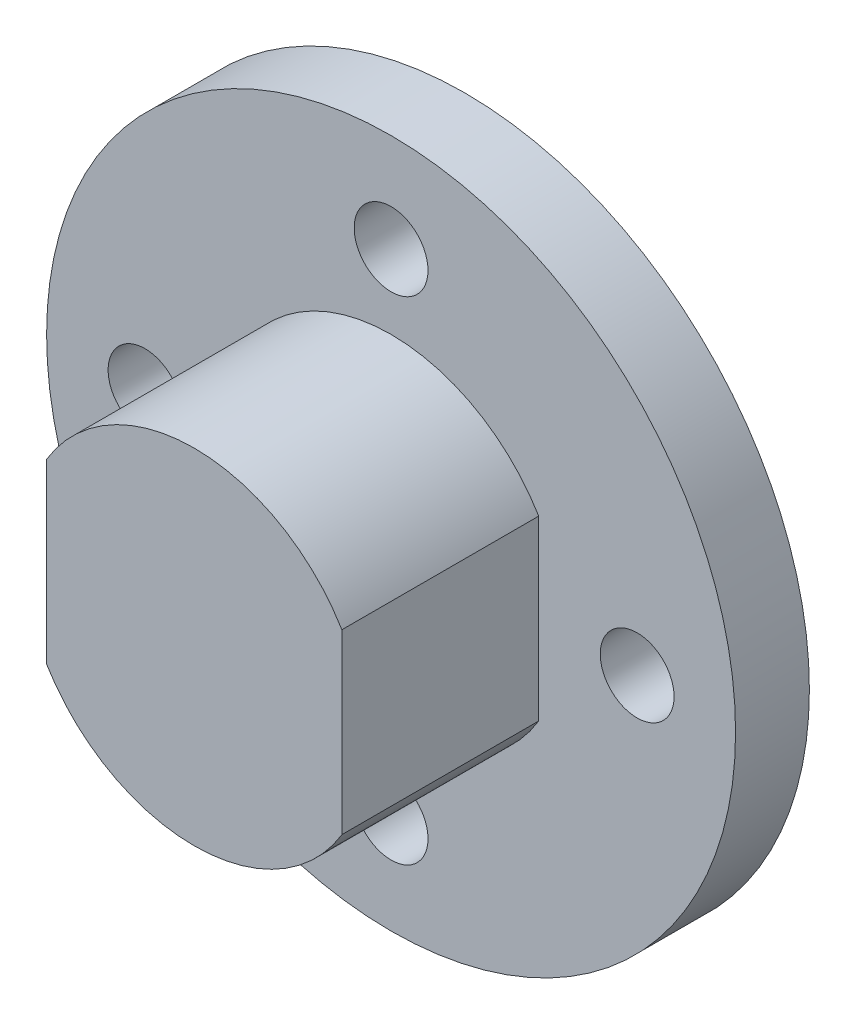
ISO-10303-21;
HEADER;
FILE_DESCRIPTION(('STEP AP214'),'2;1');
FILE_NAME('part.step','',(''),(''),'','','');
FILE_SCHEMA(('AUTOMOTIVE_DESIGN { 1 0 10303 214 1 1 1 1 }'));
ENDSEC;
DATA;
#1=APPLICATION_CONTEXT('core data for automotive mechanical design processes');
#2=APPLICATION_PROTOCOL_DEFINITION('international standard','automotive_design',2000,#1);
#3=PRODUCT_CONTEXT('',#1,'mechanical');
#4=PRODUCT('Part','Part','',(#3));
#5=PRODUCT_RELATED_PRODUCT_CATEGORY('part','',(#4));
#6=PRODUCT_DEFINITION_FORMATION('','',#4);
#7=PRODUCT_DEFINITION_CONTEXT('part definition',#1,'design');
#8=PRODUCT_DEFINITION('design','',#6,#7);
#9=PRODUCT_DEFINITION_SHAPE('','',#8);
#10=(LENGTH_UNIT() NAMED_UNIT(*) SI_UNIT(.MILLI.,.METRE.));
#11=(NAMED_UNIT(*) PLANE_ANGLE_UNIT() SI_UNIT($,.RADIAN.));
#12=(NAMED_UNIT(*) SI_UNIT($,.STERADIAN.) SOLID_ANGLE_UNIT());
#13=UNCERTAINTY_MEASURE_WITH_UNIT(LENGTH_MEASURE(1.E-05),#10,'distance_accuracy_value','');
#14=(GEOMETRIC_REPRESENTATION_CONTEXT(3) GLOBAL_UNCERTAINTY_ASSIGNED_CONTEXT((#13)) GLOBAL_UNIT_ASSIGNED_CONTEXT((#10,
#11,#12)) REPRESENTATION_CONTEXT('',''));
#15=CARTESIAN_POINT('',(0.,0.,0.));
#16=DIRECTION('',(0.,0.,1.));
#17=DIRECTION('',(1.,0.,0.));
#18=AXIS2_PLACEMENT_3D('',#15,#16,#17);
#19=CARTESIAN_POINT('',(0.,0.,3.));
#20=DIRECTION('',(0.,0.,1.));
#21=DIRECTION('',(1.,0.,0.));
#22=AXIS2_PLACEMENT_3D('',#19,#20,#21);
#23=PLANE('',#22);
#24=CARTESIAN_POINT('',(0.,-10.,3.));
#25=DIRECTION('',(0.,0.,1.));
#26=DIRECTION('',(1.,0.,0.));
#27=AXIS2_PLACEMENT_3D('',#24,#25,#26);
#28=CIRCLE('',#27,1.5);
#29=CARTESIAN_POINT('',(1.5,-10.,3.));
#30=VERTEX_POINT('',#29);
#31=EDGE_CURVE('E143',#30,#30,#28,.T.);
#32=ORIENTED_EDGE('',*,*,#31,.F.);
#33=EDGE_LOOP('',(#32));
#34=FACE_BOUND('',#33,.T.);
#35=CARTESIAN_POINT('',(0.,10.,3.));
#36=DIRECTION('',(0.,0.,1.));
#37=DIRECTION('',(1.,0.,0.));
#38=AXIS2_PLACEMENT_3D('',#35,#36,#37);
#39=CIRCLE('',#38,1.5);
#40=CARTESIAN_POINT('',(1.5,10.,3.));
#41=VERTEX_POINT('',#40);
#42=EDGE_CURVE('E159',#41,#41,#39,.T.);
#43=ORIENTED_EDGE('',*,*,#42,.F.);
#44=EDGE_LOOP('',(#43));
#45=FACE_BOUND('',#44,.T.);
#46=CARTESIAN_POINT('',(0.,0.,3.));
#47=DIRECTION('',(0.,0.,1.));
#48=DIRECTION('',(1.,0.,0.));
#49=AXIS2_PLACEMENT_3D('',#46,#47,#48);
#50=CIRCLE('',#49,14.);
#51=CARTESIAN_POINT('',(14.,0.,3.));
#52=VERTEX_POINT('',#51);
#53=EDGE_CURVE('E11',#52,#52,#50,.T.);
#54=ORIENTED_EDGE('',*,*,#53,.T.);
#55=EDGE_LOOP('',(#54));
#56=FACE_BOUND('',#55,.T.);
#57=CARTESIAN_POINT('',(10.,0.,3.));
#58=DIRECTION('',(0.,0.,1.));
#59=DIRECTION('',(1.,0.,0.));
#60=AXIS2_PLACEMENT_3D('',#57,#58,#59);
#61=CIRCLE('',#60,1.5);
#62=CARTESIAN_POINT('',(11.5,0.,3.));
#63=VERTEX_POINT('',#62);
#64=EDGE_CURVE('E151',#63,#63,#61,.T.);
#65=ORIENTED_EDGE('',*,*,#64,.F.);
#66=EDGE_LOOP('',(#65));
#67=FACE_BOUND('',#66,.T.);
#68=CARTESIAN_POINT('',(-10.,0.,3.));
#69=DIRECTION('',(0.,0.,1.));
#70=DIRECTION('',(1.,0.,0.));
#71=AXIS2_PLACEMENT_3D('',#68,#69,#70);
#72=CIRCLE('',#71,1.5);
#73=CARTESIAN_POINT('',(-8.5,0.,3.));
#74=VERTEX_POINT('',#73);
#75=EDGE_CURVE('E135',#74,#74,#72,.T.);
#76=ORIENTED_EDGE('',*,*,#75,.F.);
#77=EDGE_LOOP('',(#76));
#78=FACE_BOUND('',#77,.T.);
#79=DIRECTION('',(0.,-1.,0.));
#80=VECTOR('',#79,1.);
#81=CARTESIAN_POINT('',(-6.,3.60555127546399,3.));
#82=LINE('',#81,#80);
#83=CARTESIAN_POINT('',(-6.,3.60555127546399,3.));
#84=VERTEX_POINT('',#83);
#85=CARTESIAN_POINT('',(-6.,-3.60555127546399,3.));
#86=VERTEX_POINT('',#85);
#87=EDGE_CURVE('E103',#84,#86,#82,.T.);
#88=ORIENTED_EDGE('',*,*,#87,.F.);
#89=CARTESIAN_POINT('',(0.,0.,3.));
#90=DIRECTION('',(0.,0.,1.));
#91=DIRECTION('',(-1.,0.,0.));
#92=AXIS2_PLACEMENT_3D('',#89,#90,#91);
#93=CIRCLE('',#92,7.);
#94=CARTESIAN_POINT('',(6.,3.60555127546399,3.));
#95=VERTEX_POINT('',#94);
#96=EDGE_CURVE('E117',#95,#84,#93,.T.);
#97=ORIENTED_EDGE('',*,*,#96,.F.);
#98=DIRECTION('',(0.,1.,0.));
#99=VECTOR('',#98,1.);
#100=CARTESIAN_POINT('',(6.,3.60555127546399,3.));
#101=LINE('',#100,#99);
#102=CARTESIAN_POINT('',(6.,-3.60555127546399,3.));
#103=VERTEX_POINT('',#102);
#104=EDGE_CURVE('E83',#103,#95,#101,.T.);
#105=ORIENTED_EDGE('',*,*,#104,.F.);
#106=CARTESIAN_POINT('',(0.,0.,3.));
#107=DIRECTION('',(0.,0.,1.));
#108=DIRECTION('',(1.,0.,0.));
#109=AXIS2_PLACEMENT_3D('',#106,#107,#108);
#110=CIRCLE('',#109,7.);
#111=EDGE_CURVE('E123',#86,#103,#110,.T.);
#112=ORIENTED_EDGE('',*,*,#111,.F.);
#113=EDGE_LOOP('',(#88,#97,#105,#112));
#114=FACE_BOUND('',#113,.T.);
#115=ADVANCED_FACE('F45',(#34,#45,#56,#67,#78,#114),#23,.T.);
#116=CARTESIAN_POINT('',(0.,0.,0.));
#117=DIRECTION('',(0.,0.,1.));
#118=DIRECTION('',(1.,0.,0.));
#119=AXIS2_PLACEMENT_3D('',#116,#117,#118);
#120=PLANE('',#119);
#121=CARTESIAN_POINT('',(0.,0.,0.));
#122=DIRECTION('',(0.,0.,1.));
#123=DIRECTION('',(1.,0.,0.));
#124=AXIS2_PLACEMENT_3D('',#121,#122,#123);
#125=CIRCLE('',#124,14.);
#126=CARTESIAN_POINT('',(14.,0.,0.));
#127=VERTEX_POINT('',#126);
#128=EDGE_CURVE('E49',#127,#127,#125,.T.);
#129=ORIENTED_EDGE('',*,*,#128,.F.);
#130=EDGE_LOOP('',(#129));
#131=FACE_BOUND('',#130,.T.);
#132=CARTESIAN_POINT('',(0.,10.,0.));
#133=DIRECTION('',(0.,0.,1.));
#134=DIRECTION('',(1.,0.,0.));
#135=AXIS2_PLACEMENT_3D('',#132,#133,#134);
#136=CIRCLE('',#135,1.5);
#137=CARTESIAN_POINT('',(1.5,10.,0.));
#138=VERTEX_POINT('',#137);
#139=EDGE_CURVE('E155',#138,#138,#136,.T.);
#140=ORIENTED_EDGE('',*,*,#139,.T.);
#141=EDGE_LOOP('',(#140));
#142=FACE_BOUND('',#141,.T.);
#143=CARTESIAN_POINT('',(10.,0.,0.));
#144=DIRECTION('',(0.,0.,1.));
#145=DIRECTION('',(1.,0.,0.));
#146=AXIS2_PLACEMENT_3D('',#143,#144,#145);
#147=CIRCLE('',#146,1.5);
#148=CARTESIAN_POINT('',(11.5,0.,0.));
#149=VERTEX_POINT('',#148);
#150=EDGE_CURVE('E147',#149,#149,#147,.T.);
#151=ORIENTED_EDGE('',*,*,#150,.T.);
#152=EDGE_LOOP('',(#151));
#153=FACE_BOUND('',#152,.T.);
#154=CARTESIAN_POINT('',(0.,-10.,0.));
#155=DIRECTION('',(0.,0.,1.));
#156=DIRECTION('',(1.,0.,0.));
#157=AXIS2_PLACEMENT_3D('',#154,#155,#156);
#158=CIRCLE('',#157,1.5);
#159=CARTESIAN_POINT('',(1.5,-10.,0.));
#160=VERTEX_POINT('',#159);
#161=EDGE_CURVE('E139',#160,#160,#158,.T.);
#162=ORIENTED_EDGE('',*,*,#161,.T.);
#163=EDGE_LOOP('',(#162));
#164=FACE_BOUND('',#163,.T.);
#165=CARTESIAN_POINT('',(-10.,0.,0.));
#166=DIRECTION('',(0.,0.,1.));
#167=DIRECTION('',(1.,0.,0.));
#168=AXIS2_PLACEMENT_3D('',#165,#166,#167);
#169=CIRCLE('',#168,1.5);
#170=CARTESIAN_POINT('',(-8.5,0.,0.));
#171=VERTEX_POINT('',#170);
#172=EDGE_CURVE('E134',#171,#171,#169,.T.);
#173=ORIENTED_EDGE('',*,*,#172,.T.);
#174=EDGE_LOOP('',(#173));
#175=FACE_BOUND('',#174,.T.);
#176=ADVANCED_FACE('F167',(#131,#142,#153,#164,#175),#120,.F.);
#177=CARTESIAN_POINT('',(0.,0.,3.));
#178=DIRECTION('',(0.,0.,-1.));
#179=DIRECTION('',(-1.,0.,0.));
#180=AXIS2_PLACEMENT_3D('',#177,#178,#179);
#181=CYLINDRICAL_SURFACE('',#180,14.);
#182=ORIENTED_EDGE('',*,*,#53,.F.);
#183=EDGE_LOOP('',(#182));
#184=FACE_BOUND('',#183,.T.);
#185=ORIENTED_EDGE('',*,*,#128,.T.);
#186=EDGE_LOOP('',(#185));
#187=FACE_BOUND('',#186,.T.);
#188=ADVANCED_FACE('F47',(#184,#187),#181,.T.);
#189=CARTESIAN_POINT('',(0.,10.,3.));
#190=DIRECTION('',(0.,0.,-1.));
#191=DIRECTION('',(-1.,0.,0.));
#192=AXIS2_PLACEMENT_3D('',#189,#190,#191);
#193=CYLINDRICAL_SURFACE('',#192,1.5);
#194=ORIENTED_EDGE('',*,*,#42,.T.);
#195=EDGE_LOOP('',(#194));
#196=FACE_BOUND('',#195,.T.);
#197=ORIENTED_EDGE('',*,*,#139,.F.);
#198=EDGE_LOOP('',(#197));
#199=FACE_BOUND('',#198,.T.);
#200=ADVANCED_FACE('F170',(#196,#199),#193,.F.);
#201=CARTESIAN_POINT('',(10.,0.,3.));
#202=DIRECTION('',(0.,0.,-1.));
#203=DIRECTION('',(-1.,0.,0.));
#204=AXIS2_PLACEMENT_3D('',#201,#202,#203);
#205=CYLINDRICAL_SURFACE('',#204,1.5);
#206=ORIENTED_EDGE('',*,*,#64,.T.);
#207=EDGE_LOOP('',(#206));
#208=FACE_BOUND('',#207,.T.);
#209=ORIENTED_EDGE('',*,*,#150,.F.);
#210=EDGE_LOOP('',(#209));
#211=FACE_BOUND('',#210,.T.);
#212=ADVANCED_FACE('F172',(#208,#211),#205,.F.);
#213=CARTESIAN_POINT('',(0.,-10.,3.));
#214=DIRECTION('',(0.,0.,-1.));
#215=DIRECTION('',(-1.,0.,0.));
#216=AXIS2_PLACEMENT_3D('',#213,#214,#215);
#217=CYLINDRICAL_SURFACE('',#216,1.5);
#218=ORIENTED_EDGE('',*,*,#31,.T.);
#219=EDGE_LOOP('',(#218));
#220=FACE_BOUND('',#219,.T.);
#221=ORIENTED_EDGE('',*,*,#161,.F.);
#222=EDGE_LOOP('',(#221));
#223=FACE_BOUND('',#222,.T.);
#224=ADVANCED_FACE('F179',(#220,#223),#217,.F.);
#225=CARTESIAN_POINT('',(-10.,0.,3.));
#226=DIRECTION('',(0.,0.,-1.));
#227=DIRECTION('',(-1.,0.,0.));
#228=AXIS2_PLACEMENT_3D('',#225,#226,#227);
#229=CYLINDRICAL_SURFACE('',#228,1.5);
#230=ORIENTED_EDGE('',*,*,#75,.T.);
#231=EDGE_LOOP('',(#230));
#232=FACE_BOUND('',#231,.T.);
#233=ORIENTED_EDGE('',*,*,#172,.F.);
#234=EDGE_LOOP('',(#233));
#235=FACE_BOUND('',#234,.T.);
#236=ADVANCED_FACE('F218',(#232,#235),#229,.F.);
#237=CARTESIAN_POINT('',(0.,0.,11.));
#238=DIRECTION('',(0.,0.,-1.));
#239=DIRECTION('',(-1.,0.,0.));
#240=AXIS2_PLACEMENT_3D('',#237,#238,#239);
#241=CYLINDRICAL_SURFACE('',#240,7.);
#242=ORIENTED_EDGE('',*,*,#96,.T.);
#243=DIRECTION('',(0.,0.,-1.));
#244=VECTOR('',#243,1.);
#245=CARTESIAN_POINT('',(-6.,3.60555127546399,11.));
#246=LINE('',#245,#244);
#247=CARTESIAN_POINT('',(-6.,3.60555127546399,11.));
#248=VERTEX_POINT('',#247);
#249=EDGE_CURVE('E107',#248,#84,#246,.T.);
#250=ORIENTED_EDGE('',*,*,#249,.F.);
#251=CARTESIAN_POINT('',(0.,0.,11.));
#252=DIRECTION('',(0.,0.,1.));
#253=DIRECTION('',(-1.,0.,0.));
#254=AXIS2_PLACEMENT_3D('',#251,#252,#253);
#255=CIRCLE('',#254,7.);
#256=CARTESIAN_POINT('',(6.,3.60555127546399,11.));
#257=VERTEX_POINT('',#256);
#258=EDGE_CURVE('E95',#257,#248,#255,.T.);
#259=ORIENTED_EDGE('',*,*,#258,.F.);
#260=DIRECTION('',(0.,0.,-1.));
#261=VECTOR('',#260,1.);
#262=CARTESIAN_POINT('',(6.,3.60555127546399,11.));
#263=LINE('',#262,#261);
#264=EDGE_CURVE('E113',#257,#95,#263,.T.);
#265=ORIENTED_EDGE('',*,*,#264,.T.);
#266=EDGE_LOOP('',(#242,#250,#259,#265));
#267=FACE_BOUND('',#266,.T.);
#268=ADVANCED_FACE('F204',(#267),#241,.T.);
#269=CARTESIAN_POINT('',(-6.,3.60555127546399,11.));
#270=DIRECTION('',(1.,0.,0.));
#271=DIRECTION('',(0.,0.,-1.));
#272=AXIS2_PLACEMENT_3D('',#269,#270,#271);
#273=PLANE('',#272);
#274=ORIENTED_EDGE('',*,*,#87,.T.);
#275=DIRECTION('',(0.,0.,-1.));
#276=VECTOR('',#275,1.);
#277=CARTESIAN_POINT('',(-6.,-3.60555127546399,11.));
#278=LINE('',#277,#276);
#279=CARTESIAN_POINT('',(-6.,-3.60555127546399,11.));
#280=VERTEX_POINT('',#279);
#281=EDGE_CURVE('E100',#280,#86,#278,.T.);
#282=ORIENTED_EDGE('',*,*,#281,.F.);
#283=DIRECTION('',(0.,-1.,0.));
#284=VECTOR('',#283,1.);
#285=CARTESIAN_POINT('',(-6.,3.60555127546399,11.));
#286=LINE('',#285,#284);
#287=EDGE_CURVE('E90',#248,#280,#286,.T.);
#288=ORIENTED_EDGE('',*,*,#287,.F.);
#289=ORIENTED_EDGE('',*,*,#249,.T.);
#290=EDGE_LOOP('',(#274,#282,#288,#289));
#291=FACE_BOUND('',#290,.T.);
#292=ADVANCED_FACE('F101',(#291),#273,.F.);
#293=CARTESIAN_POINT('',(0.,0.,11.));
#294=DIRECTION('',(0.,0.,-1.));
#295=DIRECTION('',(-1.,0.,0.));
#296=AXIS2_PLACEMENT_3D('',#293,#294,#295);
#297=CYLINDRICAL_SURFACE('',#296,7.);
#298=ORIENTED_EDGE('',*,*,#111,.T.);
#299=DIRECTION('',(0.,0.,-1.));
#300=VECTOR('',#299,1.);
#301=CARTESIAN_POINT('',(6.,-3.60555127546399,11.));
#302=LINE('',#301,#300);
#303=CARTESIAN_POINT('',(6.,-3.60555127546399,11.));
#304=VERTEX_POINT('',#303);
#305=EDGE_CURVE('E61',#304,#103,#302,.T.);
#306=ORIENTED_EDGE('',*,*,#305,.F.);
#307=CARTESIAN_POINT('',(0.,0.,11.));
#308=DIRECTION('',(0.,0.,1.));
#309=DIRECTION('',(1.,0.,0.));
#310=AXIS2_PLACEMENT_3D('',#307,#308,#309);
#311=CIRCLE('',#310,7.);
#312=EDGE_CURVE('E93',#280,#304,#311,.T.);
#313=ORIENTED_EDGE('',*,*,#312,.F.);
#314=ORIENTED_EDGE('',*,*,#281,.T.);
#315=EDGE_LOOP('',(#298,#306,#313,#314));
#316=FACE_BOUND('',#315,.T.);
#317=ADVANCED_FACE('F109',(#316),#297,.T.);
#318=CARTESIAN_POINT('',(6.,3.60555127546399,11.));
#319=DIRECTION('',(-1.,0.,0.));
#320=DIRECTION('',(0.,0.,1.));
#321=AXIS2_PLACEMENT_3D('',#318,#319,#320);
#322=PLANE('',#321);
#323=ORIENTED_EDGE('',*,*,#104,.T.);
#324=ORIENTED_EDGE('',*,*,#264,.F.);
#325=DIRECTION('',(0.,1.,0.));
#326=VECTOR('',#325,1.);
#327=CARTESIAN_POINT('',(6.,3.60555127546399,11.));
#328=LINE('',#327,#326);
#329=EDGE_CURVE('E69',#304,#257,#328,.T.);
#330=ORIENTED_EDGE('',*,*,#329,.F.);
#331=ORIENTED_EDGE('',*,*,#305,.T.);
#332=EDGE_LOOP('',(#323,#324,#330,#331));
#333=FACE_BOUND('',#332,.T.);
#334=ADVANCED_FACE('F205',(#333),#322,.F.);
#335=CARTESIAN_POINT('',(0.,0.,11.));
#336=DIRECTION('',(0.,0.,-1.));
#337=DIRECTION('',(-1.,0.,0.));
#338=AXIS2_PLACEMENT_3D('',#335,#336,#337);
#339=PLANE('',#338);
#340=ORIENTED_EDGE('',*,*,#258,.T.);
#341=ORIENTED_EDGE('',*,*,#287,.T.);
#342=ORIENTED_EDGE('',*,*,#312,.T.);
#343=ORIENTED_EDGE('',*,*,#329,.T.);
#344=EDGE_LOOP('',(#340,#341,#342,#343));
#345=FACE_BOUND('',#344,.T.);
#346=ADVANCED_FACE('F91',(#345),#339,.F.);
#347=CLOSED_SHELL('',(#115,#176,#188,#200,#212,#224,#236,#268,#292,#317,#334,#346));
#348=MANIFOLD_SOLID_BREP('B2',#347);
#349=ADVANCED_BREP_SHAPE_REPRESENTATION('',(#18,#348),#14);
#350=SHAPE_DEFINITION_REPRESENTATION(#9,#349);
ENDSEC;
END-ISO-10303-21;
